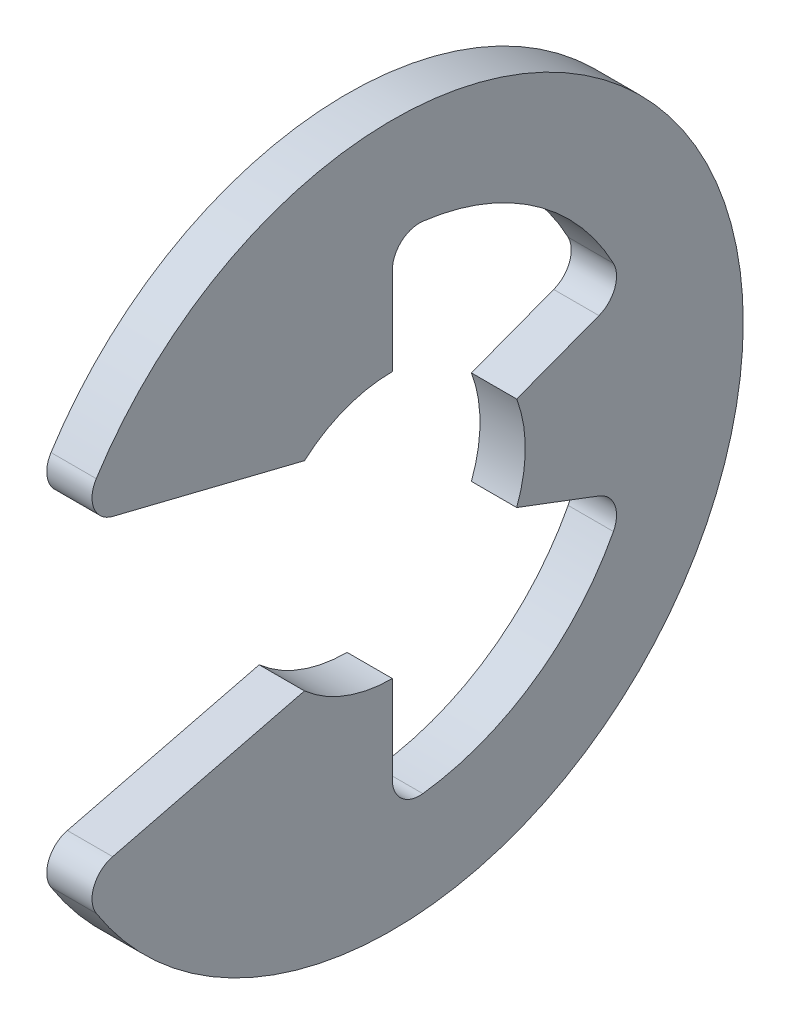
ISO-10303-21;
HEADER;
FILE_DESCRIPTION(('STEP AP214'),'2;1');
FILE_NAME('part.step','',(''),(''),'','','');
FILE_SCHEMA(('AUTOMOTIVE_DESIGN { 1 0 10303 214 1 1 1 1 }'));
ENDSEC;
DATA;
#1=APPLICATION_CONTEXT('core data for automotive mechanical design processes');
#2=APPLICATION_PROTOCOL_DEFINITION('international standard','automotive_design',2000,#1);
#3=PRODUCT_CONTEXT('',#1,'mechanical');
#4=PRODUCT('Part','Part','',(#3));
#5=PRODUCT_RELATED_PRODUCT_CATEGORY('part','',(#4));
#6=PRODUCT_DEFINITION_FORMATION('','',#4);
#7=PRODUCT_DEFINITION_CONTEXT('part definition',#1,'design');
#8=PRODUCT_DEFINITION('design','',#6,#7);
#9=PRODUCT_DEFINITION_SHAPE('','',#8);
#10=(LENGTH_UNIT() NAMED_UNIT(*) SI_UNIT(.MILLI.,.METRE.));
#11=(NAMED_UNIT(*) PLANE_ANGLE_UNIT() SI_UNIT($,.RADIAN.));
#12=(NAMED_UNIT(*) SI_UNIT($,.STERADIAN.) SOLID_ANGLE_UNIT());
#13=UNCERTAINTY_MEASURE_WITH_UNIT(LENGTH_MEASURE(1.E-05),#10,'distance_accuracy_value','');
#14=(GEOMETRIC_REPRESENTATION_CONTEXT(3) GLOBAL_UNCERTAINTY_ASSIGNED_CONTEXT((#13)) GLOBAL_UNIT_ASSIGNED_CONTEXT((#10,
#11,#12)) REPRESENTATION_CONTEXT('',''));
#15=CARTESIAN_POINT('',(0.,0.,0.));
#16=DIRECTION('',(0.,0.,1.));
#17=DIRECTION('',(1.,0.,0.));
#18=AXIS2_PLACEMENT_3D('',#15,#16,#17);
#19=CARTESIAN_POINT('',(0.350000000000183,0.,0.));
#20=DIRECTION('',(-1.,0.,0.));
#21=DIRECTION('',(0.,0.,1.));
#22=AXIS2_PLACEMENT_3D('',#19,#20,#21);
#23=CYLINDRICAL_SURFACE('',#22,5.425);
#24=CARTESIAN_POINT('',(0.350000000000183,0.,0.));
#25=DIRECTION('',(1.,0.,0.));
#26=DIRECTION('',(0.,0.,-1.));
#27=AXIS2_PLACEMENT_3D('',#24,#25,#26);
#28=CIRCLE('',#27,5.425);
#29=CARTESIAN_POINT('',(0.350000000000295,-2.91048609757349,4.57817602062516));
#30=VERTEX_POINT('',#29);
#31=CARTESIAN_POINT('',(0.35000000000085,2.91048609757416,4.57817602062541));
#32=VERTEX_POINT('',#31);
#33=EDGE_CURVE('E179',#30,#32,#28,.T.);
#34=ORIENTED_EDGE('',*,*,#33,.F.);
#35=DIRECTION('',(-1.,0.,0.));
#36=VECTOR('',#35,1.);
#37=CARTESIAN_POINT('',(0.350000000000295,-2.91048609757349,4.57817602062516));
#38=LINE('',#37,#36);
#39=CARTESIAN_POINT('',(-0.349999999999684,-2.91048609757349,4.57817602062538));
#40=VERTEX_POINT('',#39);
#41=EDGE_CURVE('E273',#30,#40,#38,.T.);
#42=ORIENTED_EDGE('',*,*,#41,.T.);
#43=CARTESIAN_POINT('',(-0.349999999999961,-1.66533453693773E-13,0.));
#44=DIRECTION('',(1.,0.,0.));
#45=DIRECTION('',(0.,0.,-1.));
#46=AXIS2_PLACEMENT_3D('',#43,#44,#45);
#47=CIRCLE('',#46,5.425);
#48=CARTESIAN_POINT('',(-0.349999999999184,2.91048609757394,4.57817602062541));
#49=VERTEX_POINT('',#48);
#50=EDGE_CURVE('E217',#40,#49,#47,.T.);
#51=ORIENTED_EDGE('',*,*,#50,.T.);
#52=DIRECTION('',(-1.,0.,0.));
#53=VECTOR('',#52,1.);
#54=CARTESIAN_POINT('',(0.35000000000085,2.91048609757416,4.57817602062541));
#55=LINE('',#54,#53);
#56=EDGE_CURVE('E271',#49,#32,#55,.F.);
#57=ORIENTED_EDGE('',*,*,#56,.T.);
#58=EDGE_LOOP('',(#34,#42,#51,#57));
#59=FACE_BOUND('',#58,.T.);
#60=ADVANCED_FACE('F41',(#59),#23,.T.);
#61=CARTESIAN_POINT('',(0.350000000000683,2.41039731260284,4.86010388730507));
#62=DIRECTION('',(0.,0.97053682992537,-0.240952820606874));
#63=DIRECTION('',(0.,0.240952820606873,0.970536829925373));
#64=AXIS2_PLACEMENT_3D('',#61,#62,#63);
#65=PLANE('',#64);
#66=DIRECTION('',(0.,-0.240952820606873,-0.970536829925373));
#67=VECTOR('',#66,1.);
#68=CARTESIAN_POINT('',(0.350000000000683,2.41039731260284,4.86010388730507));
#69=LINE('',#68,#67);
#70=CARTESIAN_POINT('',(0.350000000000683,2.27753267306377,4.32493677142581));
#71=VERTEX_POINT('',#70);
#72=CARTESIAN_POINT('',(0.350000000000183,1.54124999999961,1.35925473606036));
#73=VERTEX_POINT('',#72);
#74=EDGE_CURVE('E165',#71,#73,#69,.T.);
#75=ORIENTED_EDGE('',*,*,#74,.F.);
#76=DIRECTION('',(-1.,0.,0.));
#77=VECTOR('',#76,1.);
#78=CARTESIAN_POINT('',(0.350000000000683,2.27753267306377,4.32493677142581));
#79=LINE('',#78,#77);
#80=CARTESIAN_POINT('',(-0.349999999999129,2.27753267306396,4.32493677142642));
#81=VERTEX_POINT('',#80);
#82=EDGE_CURVE('E285',#71,#81,#79,.T.);
#83=ORIENTED_EDGE('',*,*,#82,.T.);
#84=DIRECTION('',(0.,-0.240952820606873,-0.970536829925373));
#85=VECTOR('',#84,1.);
#86=CARTESIAN_POINT('',(-0.349999999999406,2.41039731260312,4.86010388730551));
#87=LINE('',#86,#85);
#88=CARTESIAN_POINT('',(-0.349999999999906,1.54125000000011,1.35925473606016));
#89=VERTEX_POINT('',#88);
#90=EDGE_CURVE('E185',#81,#89,#87,.T.);
#91=ORIENTED_EDGE('',*,*,#90,.T.);
#92=DIRECTION('',(-1.,0.,0.));
#93=VECTOR('',#92,1.);
#94=CARTESIAN_POINT('',(0.350000000000183,1.54124999999961,1.35925473606036));
#95=LINE('',#94,#93);
#96=EDGE_CURVE('E182',#73,#89,#95,.T.);
#97=ORIENTED_EDGE('',*,*,#96,.F.);
#98=EDGE_LOOP('',(#75,#83,#91,#97));
#99=FACE_BOUND('',#98,.T.);
#100=ADVANCED_FACE('F183',(#99),#65,.F.);
#101=CARTESIAN_POINT('',(0.350000000000183,0.,0.));
#102=DIRECTION('',(-1.,0.,0.));
#103=DIRECTION('',(0.,0.,1.));
#104=AXIS2_PLACEMENT_3D('',#101,#102,#103);
#105=CYLINDRICAL_SURFACE('',#104,2.055);
#106=CARTESIAN_POINT('',(-0.349999999999961,-1.66533453693773E-13,0.));
#107=DIRECTION('',(-1.,0.,0.));
#108=DIRECTION('',(0.,0.,1.));
#109=AXIS2_PLACEMENT_3D('',#106,#107,#108);
#110=CIRCLE('',#109,2.055);
#111=CARTESIAN_POINT('',(-0.350000000000128,2.05499999999928,4.71844785465692E-13));
#112=VERTEX_POINT('',#111);
#113=EDGE_CURVE('E221',#89,#112,#110,.T.);
#114=ORIENTED_EDGE('',*,*,#113,.T.);
#115=DIRECTION('',(-1.,0.,0.));
#116=VECTOR('',#115,1.);
#117=CARTESIAN_POINT('',(0.350000000000128,2.05499999999947,9.43689570931383E-13));
#118=LINE('',#117,#116);
#119=CARTESIAN_POINT('',(0.350000000000128,2.05499999999947,9.43689570931383E-13));
#120=VERTEX_POINT('',#119);
#121=EDGE_CURVE('E189',#120,#112,#118,.T.);
#122=ORIENTED_EDGE('',*,*,#121,.F.);
#123=CARTESIAN_POINT('',(0.350000000000183,0.,0.));
#124=DIRECTION('',(-1.,0.,0.));
#125=DIRECTION('',(0.,0.,1.));
#126=AXIS2_PLACEMENT_3D('',#123,#124,#125);
#127=CIRCLE('',#126,2.055);
#128=EDGE_CURVE('E171',#73,#120,#127,.T.);
#129=ORIENTED_EDGE('',*,*,#128,.F.);
#130=ORIENTED_EDGE('',*,*,#96,.T.);
#131=EDGE_LOOP('',(#114,#122,#129,#130));
#132=FACE_BOUND('',#131,.T.);
#133=ADVANCED_FACE('F191',(#132),#105,.F.);
#134=CARTESIAN_POINT('',(0.350000000000128,2.05499999999947,9.43689570931383E-13));
#135=DIRECTION('',(0.,0.,1.));
#136=DIRECTION('',(0.,-0.999999999999997,0.));
#137=AXIS2_PLACEMENT_3D('',#134,#135,#136);
#138=PLANE('',#137);
#139=DIRECTION('',(0.,0.999999999999997,0.));
#140=VECTOR('',#139,1.);
#141=CARTESIAN_POINT('',(-0.350000000000128,2.05499999999928,4.71844785465692E-13));
#142=LINE('',#141,#140);
#143=CARTESIAN_POINT('',(-0.34999999999985,3.41491421940709,0.));
#144=VERTEX_POINT('',#143);
#145=EDGE_CURVE('E223',#112,#144,#142,.T.);
#146=ORIENTED_EDGE('',*,*,#145,.T.);
#147=DIRECTION('',(1.,0.,0.));
#148=VECTOR('',#147,1.);
#149=CARTESIAN_POINT('',(0.350000000000239,3.41491421940709,-4.44089209850063E-13));
#150=LINE('',#149,#148);
#151=CARTESIAN_POINT('',(0.350000000000239,3.41491421940709,-4.44089209850063E-13));
#152=VERTEX_POINT('',#151);
#153=EDGE_CURVE('E269',#144,#152,#150,.T.);
#154=ORIENTED_EDGE('',*,*,#153,.T.);
#155=DIRECTION('',(0.,0.999999999999997,0.));
#156=VECTOR('',#155,1.);
#157=CARTESIAN_POINT('',(0.350000000000128,2.05499999999947,9.43689570931383E-13));
#158=LINE('',#157,#156);
#159=EDGE_CURVE('E194',#120,#152,#158,.T.);
#160=ORIENTED_EDGE('',*,*,#159,.F.);
#161=ORIENTED_EDGE('',*,*,#121,.T.);
#162=EDGE_LOOP('',(#146,#154,#160,#161));
#163=FACE_BOUND('',#162,.T.);
#164=ADVANCED_FACE('F391',(#163),#138,.F.);
#165=CARTESIAN_POINT('',(0.350000000000183,0.,0.));
#166=DIRECTION('',(-1.,0.,0.));
#167=DIRECTION('',(0.,0.,1.));
#168=AXIS2_PLACEMENT_3D('',#165,#166,#167);
#169=CYLINDRICAL_SURFACE('',#168,3.86064516129032);
#170=CARTESIAN_POINT('',(0.350000000000183,0.,0.));
#171=DIRECTION('',(-1.,0.,0.));
#172=DIRECTION('',(0.,0.,-1.));
#173=AXIS2_PLACEMENT_3D('',#170,#171,#172);
#174=CIRCLE('',#173,3.86064516129032);
#175=CARTESIAN_POINT('',(0.350000000000183,3.831773240002,-0.471269454340478));
#176=VERTEX_POINT('',#175);
#177=CARTESIAN_POINT('',(0.350000000000295,1.79556862973601,-3.41767674850946));
#178=VERTEX_POINT('',#177);
#179=EDGE_CURVE('E196',#176,#178,#174,.T.);
#180=ORIENTED_EDGE('',*,*,#179,.F.);
#181=DIRECTION('',(-1.,0.,0.));
#182=VECTOR('',#181,1.);
#183=CARTESIAN_POINT('',(0.350000000000183,3.831773240002,-0.471269454340478));
#184=LINE('',#183,#182);
#185=CARTESIAN_POINT('',(-0.349999999999795,3.83177324000242,-0.471269454340506));
#186=VERTEX_POINT('',#185);
#187=EDGE_CURVE('E266',#176,#186,#184,.T.);
#188=ORIENTED_EDGE('',*,*,#187,.T.);
#189=CARTESIAN_POINT('',(-0.349999999999961,-1.66533453693773E-13,0.));
#190=DIRECTION('',(-1.,0.,0.));
#191=DIRECTION('',(0.,0.,-1.));
#192=AXIS2_PLACEMENT_3D('',#189,#190,#191);
#193=CIRCLE('',#192,3.86064516129032);
#194=CARTESIAN_POINT('',(-0.349999999999739,1.79556862973621,-3.41767674850876));
#195=VERTEX_POINT('',#194);
#196=EDGE_CURVE('E226',#186,#195,#193,.T.);
#197=ORIENTED_EDGE('',*,*,#196,.T.);
#198=DIRECTION('',(-1.,0.,0.));
#199=VECTOR('',#198,1.);
#200=CARTESIAN_POINT('',(0.350000000000295,1.79556862973601,-3.41767674850946));
#201=LINE('',#200,#199);
#202=EDGE_CURVE('E264',#195,#178,#201,.F.);
#203=ORIENTED_EDGE('',*,*,#202,.T.);
#204=EDGE_LOOP('',(#180,#188,#197,#203));
#205=FACE_BOUND('',#204,.T.);
#206=ADVANCED_FACE('F313',(#205),#169,.F.);
#207=CARTESIAN_POINT('',(0.349999999999961,0.726552217669374,-1.92227648245508));
#208=DIRECTION('',(0.,-0.935414346693482,-0.353553390593276));
#209=DIRECTION('',(0.,0.353553390593274,-0.935414346693486));
#210=AXIS2_PLACEMENT_3D('',#207,#208,#209);
#211=PLANE('',#210);
#212=DIRECTION('',(0.,-0.353553390593274,0.935414346693486));
#213=VECTOR('',#212,1.);
#214=CARTESIAN_POINT('',(0.349999999999961,0.726552217669374,-1.92227648245508));
#215=LINE('',#214,#213);
#216=CARTESIAN_POINT('',(0.350000000000739,1.20735450085685,-3.19435975356042));
#217=VERTEX_POINT('',#216);
#218=CARTESIAN_POINT('',(0.349999999999961,0.726552217669374,-1.92227648245508));
#219=VERTEX_POINT('',#218);
#220=EDGE_CURVE('E201',#217,#219,#215,.T.);
#221=ORIENTED_EDGE('',*,*,#220,.F.);
#222=DIRECTION('',(1.,0.,0.));
#223=VECTOR('',#222,1.);
#224=CARTESIAN_POINT('',(-0.349999999999406,1.20735450085668,-3.19435975356036));
#225=LINE('',#224,#223);
#226=CARTESIAN_POINT('',(-0.349999999999406,1.20735450085668,-3.19435975356036));
#227=VERTEX_POINT('',#226);
#228=EDGE_CURVE('E288',#217,#227,#225,.F.);
#229=ORIENTED_EDGE('',*,*,#228,.T.);
#230=DIRECTION('',(0.,-0.353553390593274,0.935414346693486));
#231=VECTOR('',#230,1.);
#232=CARTESIAN_POINT('',(-0.350000000000072,0.726552217669402,-1.92227648245488));
#233=LINE('',#232,#231);
#234=CARTESIAN_POINT('',(-0.350000000000072,0.726552217669402,-1.92227648245488));
#235=VERTEX_POINT('',#234);
#236=EDGE_CURVE('E229',#227,#235,#233,.T.);
#237=ORIENTED_EDGE('',*,*,#236,.T.);
#238=DIRECTION('',(-1.,0.,0.));
#239=VECTOR('',#238,1.);
#240=CARTESIAN_POINT('',(0.349999999999961,0.726552217669374,-1.92227648245508));
#241=LINE('',#240,#239);
#242=EDGE_CURVE('E253',#219,#235,#241,.T.);
#243=ORIENTED_EDGE('',*,*,#242,.F.);
#244=EDGE_LOOP('',(#221,#229,#237,#243));
#245=FACE_BOUND('',#244,.T.);
#246=ADVANCED_FACE('F316',(#245),#211,.F.);
#247=CARTESIAN_POINT('',(0.350000000000183,0.,0.));
#248=DIRECTION('',(-1.,0.,0.));
#249=DIRECTION('',(0.,0.,1.));
#250=AXIS2_PLACEMENT_3D('',#247,#248,#249);
#251=CYLINDRICAL_SURFACE('',#250,2.055);
#252=CARTESIAN_POINT('',(-0.349999999999961,-1.66533453693773E-13,0.));
#253=DIRECTION('',(-1.,0.,0.));
#254=DIRECTION('',(0.,0.,1.));
#255=AXIS2_PLACEMENT_3D('',#252,#253,#254);
#256=CIRCLE('',#255,2.055);
#257=CARTESIAN_POINT('',(-0.35000000000035,-0.726552217668708,-1.92227648245488));
#258=VERTEX_POINT('',#257);
#259=EDGE_CURVE('E231',#235,#258,#256,.T.);
#260=ORIENTED_EDGE('',*,*,#259,.T.);
#261=DIRECTION('',(-1.,0.,0.));
#262=VECTOR('',#261,1.);
#263=CARTESIAN_POINT('',(0.349999999999628,-0.726552217668652,-1.92227648245491));
#264=LINE('',#263,#262);
#265=CARTESIAN_POINT('',(0.349999999999628,-0.726552217668652,-1.92227648245491));
#266=VERTEX_POINT('',#265);
#267=EDGE_CURVE('E250',#266,#258,#264,.T.);
#268=ORIENTED_EDGE('',*,*,#267,.F.);
#269=CARTESIAN_POINT('',(0.350000000000183,0.,0.));
#270=DIRECTION('',(-1.,0.,0.));
#271=DIRECTION('',(0.,0.,1.));
#272=AXIS2_PLACEMENT_3D('',#269,#270,#271);
#273=CIRCLE('',#272,2.055);
#274=EDGE_CURVE('E203',#219,#266,#273,.T.);
#275=ORIENTED_EDGE('',*,*,#274,.F.);
#276=ORIENTED_EDGE('',*,*,#242,.T.);
#277=EDGE_LOOP('',(#260,#268,#275,#276));
#278=FACE_BOUND('',#277,.T.);
#279=ADVANCED_FACE('F322',(#278),#251,.F.);
#280=CARTESIAN_POINT('',(0.349999999999628,-0.726552217668652,-1.92227648245491));
#281=DIRECTION('',(0.,0.935414346693482,-0.353553390593273));
#282=DIRECTION('',(0.,0.353553390593275,0.935414346693486));
#283=AXIS2_PLACEMENT_3D('',#280,#281,#282);
#284=PLANE('',#283);
#285=DIRECTION('',(0.,-0.353553390593275,-0.935414346693486));
#286=VECTOR('',#285,1.);
#287=CARTESIAN_POINT('',(-0.35000000000035,-0.726552217668708,-1.92227648245488));
#288=LINE('',#287,#286);
#289=CARTESIAN_POINT('',(-0.350000000000017,-1.20735450085663,-3.19435975356153));
#290=VERTEX_POINT('',#289);
#291=EDGE_CURVE('E233',#258,#290,#288,.T.);
#292=ORIENTED_EDGE('',*,*,#291,.T.);
#293=DIRECTION('',(1.,0.,0.));
#294=VECTOR('',#293,1.);
#295=CARTESIAN_POINT('',(0.350000000000017,-1.20735450085641,-3.19435975356086));
#296=LINE('',#295,#294);
#297=CARTESIAN_POINT('',(0.350000000000017,-1.20735450085641,-3.19435975356086));
#298=VERTEX_POINT('',#297);
#299=EDGE_CURVE('E56',#290,#298,#296,.T.);
#300=ORIENTED_EDGE('',*,*,#299,.T.);
#301=DIRECTION('',(0.,-0.353553390593275,-0.935414346693486));
#302=VECTOR('',#301,1.);
#303=CARTESIAN_POINT('',(0.349999999999628,-0.726552217668652,-1.92227648245491));
#304=LINE('',#303,#302);
#305=EDGE_CURVE('E205',#266,#298,#304,.T.);
#306=ORIENTED_EDGE('',*,*,#305,.F.);
#307=ORIENTED_EDGE('',*,*,#267,.T.);
#308=EDGE_LOOP('',(#292,#300,#306,#307));
#309=FACE_BOUND('',#308,.T.);
#310=ADVANCED_FACE('F324',(#309),#284,.F.);
#311=CARTESIAN_POINT('',(0.350000000000183,0.,0.));
#312=DIRECTION('',(-1.,0.,0.));
#313=DIRECTION('',(0.,0.,1.));
#314=AXIS2_PLACEMENT_3D('',#311,#312,#313);
#315=CYLINDRICAL_SURFACE('',#314,3.86064516129032);
#316=CARTESIAN_POINT('',(-0.349999999999961,-1.66533453693773E-13,0.));
#317=DIRECTION('',(-1.,0.,0.));
#318=DIRECTION('',(0.,0.,-1.));
#319=AXIS2_PLACEMENT_3D('',#316,#317,#318);
#320=CIRCLE('',#319,3.86064516129032);
#321=CARTESIAN_POINT('',(-0.350000000000295,-1.79556862973662,-3.41767674850907));
#322=VERTEX_POINT('',#321);
#323=CARTESIAN_POINT('',(-0.349999999999073,-3.83177324000283,-0.471269454340256));
#324=VERTEX_POINT('',#323);
#325=EDGE_CURVE('E235',#322,#324,#320,.T.);
#326=ORIENTED_EDGE('',*,*,#325,.T.);
#327=DIRECTION('',(-1.,0.,0.));
#328=VECTOR('',#327,1.);
#329=CARTESIAN_POINT('',(0.35000000000085,-3.83177324000278,-0.471269454340284));
#330=LINE('',#329,#328);
#331=CARTESIAN_POINT('',(0.35000000000085,-3.83177324000278,-0.471269454340284));
#332=VERTEX_POINT('',#331);
#333=EDGE_CURVE('E262',#324,#332,#330,.F.);
#334=ORIENTED_EDGE('',*,*,#333,.T.);
#335=CARTESIAN_POINT('',(0.350000000000183,0.,0.));
#336=DIRECTION('',(-1.,0.,0.));
#337=DIRECTION('',(0.,0.,-1.));
#338=AXIS2_PLACEMENT_3D('',#335,#336,#337);
#339=CIRCLE('',#338,3.86064516129032);
#340=CARTESIAN_POINT('',(0.349999999999795,-1.79556862973612,-3.41767674850948));
#341=VERTEX_POINT('',#340);
#342=EDGE_CURVE('E207',#341,#332,#339,.T.);
#343=ORIENTED_EDGE('',*,*,#342,.F.);
#344=DIRECTION('',(-1.,0.,0.));
#345=VECTOR('',#344,1.);
#346=CARTESIAN_POINT('',(0.349999999999795,-1.79556862973612,-3.41767674850948));
#347=LINE('',#346,#345);
#348=EDGE_CURVE('E259',#341,#322,#347,.T.);
#349=ORIENTED_EDGE('',*,*,#348,.T.);
#350=EDGE_LOOP('',(#326,#334,#343,#349));
#351=FACE_BOUND('',#350,.T.);
#352=ADVANCED_FACE('F326',(#351),#315,.F.);
#353=CARTESIAN_POINT('',(0.350000000000628,-2.05500000000056,-1.94289029309402E-13));
#354=DIRECTION('',(0.,0.,1.));
#355=DIRECTION('',(0.,-0.999999999999997,0.));
#356=AXIS2_PLACEMENT_3D('',#353,#354,#355);
#357=PLANE('',#356);
#358=DIRECTION('',(0.,0.999999999999997,0.));
#359=VECTOR('',#358,1.);
#360=CARTESIAN_POINT('',(0.350000000000628,-2.05500000000056,-1.94289029309402E-13));
#361=LINE('',#360,#359);
#362=CARTESIAN_POINT('',(0.350000000000072,-3.41491421940732,4.44089209850063E-13));
#363=VERTEX_POINT('',#362);
#364=CARTESIAN_POINT('',(0.350000000000628,-2.05500000000056,-1.94289029309402E-13));
#365=VERTEX_POINT('',#364);
#366=EDGE_CURVE('E210',#363,#365,#361,.T.);
#367=ORIENTED_EDGE('',*,*,#366,.F.);
#368=DIRECTION('',(1.,0.,0.));
#369=VECTOR('',#368,1.);
#370=CARTESIAN_POINT('',(-0.349999999999961,-3.41491421940726,8.88178419700125E-13));
#371=LINE('',#370,#369);
#372=CARTESIAN_POINT('',(-0.349999999999961,-3.41491421940726,8.88178419700125E-13));
#373=VERTEX_POINT('',#372);
#374=EDGE_CURVE('E188',#363,#373,#371,.F.);
#375=ORIENTED_EDGE('',*,*,#374,.T.);
#376=DIRECTION('',(0.,0.999999999999997,0.));
#377=VECTOR('',#376,1.);
#378=CARTESIAN_POINT('',(-0.349999999999684,-2.05500000000031,0.));
#379=LINE('',#378,#377);
#380=CARTESIAN_POINT('',(-0.349999999999684,-2.05500000000031,0.));
#381=VERTEX_POINT('',#380);
#382=EDGE_CURVE('E238',#373,#381,#379,.T.);
#383=ORIENTED_EDGE('',*,*,#382,.T.);
#384=DIRECTION('',(-1.,0.,0.));
#385=VECTOR('',#384,1.);
#386=CARTESIAN_POINT('',(0.350000000000628,-2.05500000000056,-1.94289029309402E-13));
#387=LINE('',#386,#385);
#388=EDGE_CURVE('E247',#365,#381,#387,.T.);
#389=ORIENTED_EDGE('',*,*,#388,.F.);
#390=EDGE_LOOP('',(#367,#375,#383,#389));
#391=FACE_BOUND('',#390,.T.);
#392=ADVANCED_FACE('F332',(#391),#357,.F.);
#393=CARTESIAN_POINT('',(0.350000000000183,0.,0.));
#394=DIRECTION('',(-1.,0.,0.));
#395=DIRECTION('',(0.,0.,1.));
#396=AXIS2_PLACEMENT_3D('',#393,#394,#395);
#397=CYLINDRICAL_SURFACE('',#396,2.055);
#398=CARTESIAN_POINT('',(-0.349999999999961,-1.66533453693773E-13,0.));
#399=DIRECTION('',(-1.,0.,0.));
#400=DIRECTION('',(0.,0.,-1.));
#401=AXIS2_PLACEMENT_3D('',#398,#399,#400);
#402=CIRCLE('',#401,2.055);
#403=CARTESIAN_POINT('',(-0.349999999999517,-1.54125000000022,1.35925473605947));
#404=VERTEX_POINT('',#403);
#405=EDGE_CURVE('E240',#381,#404,#402,.T.);
#406=ORIENTED_EDGE('',*,*,#405,.T.);
#407=DIRECTION('',(-1.,0.,0.));
#408=VECTOR('',#407,1.);
#409=CARTESIAN_POINT('',(0.350000000000628,-1.54125000000027,1.35925473605977));
#410=LINE('',#409,#408);
#411=CARTESIAN_POINT('',(0.350000000000628,-1.54125000000027,1.35925473605977));
#412=VERTEX_POINT('',#411);
#413=EDGE_CURVE('E216',#412,#404,#410,.T.);
#414=ORIENTED_EDGE('',*,*,#413,.F.);
#415=CARTESIAN_POINT('',(0.350000000000183,0.,0.));
#416=DIRECTION('',(-1.,0.,0.));
#417=DIRECTION('',(0.,0.,-1.));
#418=AXIS2_PLACEMENT_3D('',#415,#416,#417);
#419=CIRCLE('',#418,2.055);
#420=EDGE_CURVE('E212',#365,#412,#419,.T.);
#421=ORIENTED_EDGE('',*,*,#420,.F.);
#422=ORIENTED_EDGE('',*,*,#388,.T.);
#423=EDGE_LOOP('',(#406,#414,#421,#422));
#424=FACE_BOUND('',#423,.T.);
#425=ADVANCED_FACE('F381',(#424),#397,.F.);
#426=CARTESIAN_POINT('',(0.350000000000628,-2.41039731260284,4.86010388730507));
#427=DIRECTION('',(0.,-0.97053682992537,-0.240952820606874));
#428=DIRECTION('',(0.,0.240952820606873,-0.970536829925373));
#429=AXIS2_PLACEMENT_3D('',#426,#427,#428);
#430=PLANE('',#429);
#431=DIRECTION('',(0.,-0.240952820606873,0.970536829925373));
#432=VECTOR('',#431,1.);
#433=CARTESIAN_POINT('',(-0.34999999999924,-2.41039731260259,4.86010388730509));
#434=LINE('',#433,#432);
#435=CARTESIAN_POINT('',(-0.349999999999684,-2.27753267306324,4.32493677142581));
#436=VERTEX_POINT('',#435);
#437=EDGE_CURVE('E242',#404,#436,#434,.T.);
#438=ORIENTED_EDGE('',*,*,#437,.T.);
#439=DIRECTION('',(-1.,0.,0.));
#440=VECTOR('',#439,1.);
#441=CARTESIAN_POINT('',(0.35000000000035,-2.2775326730633,4.32493677142554));
#442=LINE('',#441,#440);
#443=CARTESIAN_POINT('',(0.35000000000035,-2.2775326730633,4.32493677142554));
#444=VERTEX_POINT('',#443);
#445=EDGE_CURVE('E280',#436,#444,#442,.F.);
#446=ORIENTED_EDGE('',*,*,#445,.T.);
#447=DIRECTION('',(0.,-0.240952820606873,0.970536829925373));
#448=VECTOR('',#447,1.);
#449=CARTESIAN_POINT('',(0.350000000000628,-2.41039731260284,4.86010388730507));
#450=LINE('',#449,#448);
#451=EDGE_CURVE('E214',#412,#444,#450,.T.);
#452=ORIENTED_EDGE('',*,*,#451,.F.);
#453=ORIENTED_EDGE('',*,*,#413,.T.);
#454=EDGE_LOOP('',(#438,#446,#452,#453));
#455=FACE_BOUND('',#454,.T.);
#456=ADVANCED_FACE('F413',(#455),#430,.F.);
#457=CARTESIAN_POINT('',(0.350000000000183,0.,0.));
#458=DIRECTION('',(1.,0.,0.));
#459=DIRECTION('',(0.,0.,-1.));
#460=AXIS2_PLACEMENT_3D('',#457,#458,#459);
#461=PLANE('',#460);
#462=ORIENTED_EDGE('',*,*,#451,.T.);
#463=CARTESIAN_POINT('',(0.350000000000739,-2.68515814163273,4.22373658677011));
#464=DIRECTION('',(1.,0.,0.));
#465=DIRECTION('',(0.,0.,-1.));
#466=AXIS2_PLACEMENT_3D('',#463,#464,#465);
#467=CIRCLE('',#466,0.42);
#468=EDGE_CURVE('E283',#444,#30,#467,.T.);
#469=ORIENTED_EDGE('',*,*,#468,.T.);
#470=ORIENTED_EDGE('',*,*,#33,.T.);
#471=CARTESIAN_POINT('',(0.350000000000572,2.68515814163275,4.223736586771));
#472=DIRECTION('',(1.,0.,0.));
#473=DIRECTION('',(0.,0.,-1.));
#474=AXIS2_PLACEMENT_3D('',#471,#472,#473);
#475=CIRCLE('',#474,0.42);
#476=EDGE_CURVE('E175',#32,#71,#475,.T.);
#477=ORIENTED_EDGE('',*,*,#476,.T.);
#478=ORIENTED_EDGE('',*,*,#74,.T.);
#479=ORIENTED_EDGE('',*,*,#128,.T.);
#480=ORIENTED_EDGE('',*,*,#159,.T.);
#481=CARTESIAN_POINT('',(0.350000000000628,3.41491421940715,-0.420000000000142));
#482=DIRECTION('',(1.,0.,0.));
#483=DIRECTION('',(0.,0.,-1.));
#484=AXIS2_PLACEMENT_3D('',#481,#482,#483);
#485=CIRCLE('',#484,0.42);
#486=EDGE_CURVE('E297',#152,#176,#485,.F.);
#487=ORIENTED_EDGE('',*,*,#486,.T.);
#488=ORIENTED_EDGE('',*,*,#179,.T.);
#489=CARTESIAN_POINT('',(0.349999999999961,1.60022852646846,-3.04586732951129));
#490=DIRECTION('',(1.,0.,0.));
#491=DIRECTION('',(0.,0.,-1.));
#492=AXIS2_PLACEMENT_3D('',#489,#490,#491);
#493=CIRCLE('',#492,0.42);
#494=EDGE_CURVE('E11',#178,#217,#493,.F.);
#495=ORIENTED_EDGE('',*,*,#494,.T.);
#496=ORIENTED_EDGE('',*,*,#220,.T.);
#497=ORIENTED_EDGE('',*,*,#274,.T.);
#498=ORIENTED_EDGE('',*,*,#305,.T.);
#499=CARTESIAN_POINT('',(0.34999999999985,-1.60022852646757,-3.0458673295124));
#500=DIRECTION('',(1.,0.,0.));
#501=DIRECTION('',(0.,0.,-1.));
#502=AXIS2_PLACEMENT_3D('',#499,#500,#501);
#503=CIRCLE('',#502,0.42);
#504=EDGE_CURVE('E301',#298,#341,#503,.F.);
#505=ORIENTED_EDGE('',*,*,#504,.T.);
#506=ORIENTED_EDGE('',*,*,#342,.T.);
#507=CARTESIAN_POINT('',(0.34999999999985,-3.41491421940771,-0.419999999999615));
#508=DIRECTION('',(1.,0.,0.));
#509=DIRECTION('',(0.,0.,-1.));
#510=AXIS2_PLACEMENT_3D('',#507,#508,#509);
#511=CIRCLE('',#510,0.42);
#512=EDGE_CURVE('E293',#332,#363,#511,.F.);
#513=ORIENTED_EDGE('',*,*,#512,.T.);
#514=ORIENTED_EDGE('',*,*,#366,.T.);
#515=ORIENTED_EDGE('',*,*,#420,.T.);
#516=EDGE_LOOP('',(#462,#469,#470,#477,#478,#479,#480,#487,#488,#495,#496,#497,#498,#505,#506,
#513,#514,#515));
#517=FACE_BOUND('',#516,.T.);
#518=ADVANCED_FACE('F168',(#517),#461,.T.);
#519=CARTESIAN_POINT('',(-0.349999999999961,-1.66533453693773E-13,0.));
#520=DIRECTION('',(1.,0.,0.));
#521=DIRECTION('',(0.,0.,-1.));
#522=AXIS2_PLACEMENT_3D('',#519,#520,#521);
#523=PLANE('',#522);
#524=ORIENTED_EDGE('',*,*,#50,.F.);
#525=CARTESIAN_POINT('',(-0.349999999999462,-2.68515814163273,4.22373658676992));
#526=DIRECTION('',(1.,0.,0.));
#527=DIRECTION('',(0.,0.,-1.));
#528=AXIS2_PLACEMENT_3D('',#525,#526,#527);
#529=CIRCLE('',#528,0.42);
#530=EDGE_CURVE('E278',#40,#436,#529,.F.);
#531=ORIENTED_EDGE('',*,*,#530,.T.);
#532=ORIENTED_EDGE('',*,*,#437,.F.);
#533=ORIENTED_EDGE('',*,*,#405,.F.);
#534=ORIENTED_EDGE('',*,*,#382,.F.);
#535=CARTESIAN_POINT('',(-0.350000000000183,-3.41491421940732,-0.419999999999615));
#536=DIRECTION('',(1.,0.,0.));
#537=DIRECTION('',(0.,0.,-1.));
#538=AXIS2_PLACEMENT_3D('',#535,#536,#537);
#539=CIRCLE('',#538,0.42);
#540=EDGE_CURVE('E291',#373,#324,#539,.T.);
#541=ORIENTED_EDGE('',*,*,#540,.T.);
#542=ORIENTED_EDGE('',*,*,#325,.F.);
#543=CARTESIAN_POINT('',(-0.350000000000239,-1.60022852646796,-3.04586732951173));
#544=DIRECTION('',(1.,0.,0.));
#545=DIRECTION('',(0.,0.,-1.));
#546=AXIS2_PLACEMENT_3D('',#543,#544,#545);
#547=CIRCLE('',#546,0.42);
#548=EDGE_CURVE('E299',#322,#290,#547,.T.);
#549=ORIENTED_EDGE('',*,*,#548,.T.);
#550=ORIENTED_EDGE('',*,*,#291,.F.);
#551=ORIENTED_EDGE('',*,*,#259,.F.);
#552=ORIENTED_EDGE('',*,*,#236,.F.);
#553=CARTESIAN_POINT('',(-0.349999999999961,1.60022852646785,-3.04586732951126));
#554=DIRECTION('',(1.,0.,0.));
#555=DIRECTION('',(0.,0.,-1.));
#556=AXIS2_PLACEMENT_3D('',#553,#554,#555);
#557=CIRCLE('',#556,0.42);
#558=EDGE_CURVE('E49',#227,#195,#557,.T.);
#559=ORIENTED_EDGE('',*,*,#558,.T.);
#560=ORIENTED_EDGE('',*,*,#196,.F.);
#561=CARTESIAN_POINT('',(-0.349999999999295,3.41491421940712,-0.420000000000142));
#562=DIRECTION('',(1.,0.,0.));
#563=DIRECTION('',(0.,0.,-1.));
#564=AXIS2_PLACEMENT_3D('',#561,#562,#563);
#565=CIRCLE('',#564,0.42);
#566=EDGE_CURVE('E295',#186,#144,#565,.T.);
#567=ORIENTED_EDGE('',*,*,#566,.T.);
#568=ORIENTED_EDGE('',*,*,#145,.F.);
#569=ORIENTED_EDGE('',*,*,#113,.F.);
#570=ORIENTED_EDGE('',*,*,#90,.F.);
#571=CARTESIAN_POINT('',(-0.349999999999462,2.68515814163273,4.2237365867708));
#572=DIRECTION('',(1.,0.,0.));
#573=DIRECTION('',(0.,0.,-1.));
#574=AXIS2_PLACEMENT_3D('',#571,#572,#573);
#575=CIRCLE('',#574,0.42);
#576=EDGE_CURVE('E276',#81,#49,#575,.F.);
#577=ORIENTED_EDGE('',*,*,#576,.T.);
#578=EDGE_LOOP('',(#524,#531,#532,#533,#534,#541,#542,#549,#550,#551,#552,#559,#560,#567,#568,
#569,#570,#577));
#579=FACE_BOUND('',#578,.T.);
#580=ADVANCED_FACE('F306',(#579),#523,.F.);
#581=CARTESIAN_POINT('',(0.34999999999985,-3.41491421940771,-0.419999999999615));
#582=DIRECTION('',(-1.,0.,0.));
#583=DIRECTION('',(0.,0.,1.));
#584=AXIS2_PLACEMENT_3D('',#581,#582,#583);
#585=CYLINDRICAL_SURFACE('',#584,0.42);
#586=ORIENTED_EDGE('',*,*,#512,.F.);
#587=ORIENTED_EDGE('',*,*,#333,.F.);
#588=ORIENTED_EDGE('',*,*,#540,.F.);
#589=ORIENTED_EDGE('',*,*,#374,.F.);
#590=EDGE_LOOP('',(#586,#587,#588,#589));
#591=FACE_BOUND('',#590,.T.);
#592=ADVANCED_FACE('F346',(#591),#585,.F.);
#593=CARTESIAN_POINT('',(0.350000000000628,3.41491421940715,-0.420000000000142));
#594=DIRECTION('',(-1.,0.,0.));
#595=DIRECTION('',(0.,0.,1.));
#596=AXIS2_PLACEMENT_3D('',#593,#594,#595);
#597=CYLINDRICAL_SURFACE('',#596,0.42);
#598=ORIENTED_EDGE('',*,*,#486,.F.);
#599=ORIENTED_EDGE('',*,*,#153,.F.);
#600=ORIENTED_EDGE('',*,*,#566,.F.);
#601=ORIENTED_EDGE('',*,*,#187,.F.);
#602=EDGE_LOOP('',(#598,#599,#600,#601));
#603=FACE_BOUND('',#602,.T.);
#604=ADVANCED_FACE('F349',(#603),#597,.F.);
#605=CARTESIAN_POINT('',(0.350000000000739,-2.68515814163273,4.22373658677011));
#606=DIRECTION('',(-1.,0.,0.));
#607=DIRECTION('',(0.,0.,1.));
#608=AXIS2_PLACEMENT_3D('',#605,#606,#607);
#609=CYLINDRICAL_SURFACE('',#608,0.42);
#610=ORIENTED_EDGE('',*,*,#468,.F.);
#611=ORIENTED_EDGE('',*,*,#445,.F.);
#612=ORIENTED_EDGE('',*,*,#530,.F.);
#613=ORIENTED_EDGE('',*,*,#41,.F.);
#614=EDGE_LOOP('',(#610,#611,#612,#613));
#615=FACE_BOUND('',#614,.T.);
#616=ADVANCED_FACE('F353',(#615),#609,.T.);
#617=CARTESIAN_POINT('',(0.350000000000572,2.68515814163275,4.223736586771));
#618=DIRECTION('',(-1.,0.,0.));
#619=DIRECTION('',(0.,0.,1.));
#620=AXIS2_PLACEMENT_3D('',#617,#618,#619);
#621=CYLINDRICAL_SURFACE('',#620,0.42);
#622=ORIENTED_EDGE('',*,*,#476,.F.);
#623=ORIENTED_EDGE('',*,*,#56,.F.);
#624=ORIENTED_EDGE('',*,*,#576,.F.);
#625=ORIENTED_EDGE('',*,*,#82,.F.);
#626=EDGE_LOOP('',(#622,#623,#624,#625));
#627=FACE_BOUND('',#626,.T.);
#628=ADVANCED_FACE('F357',(#627),#621,.T.);
#629=CARTESIAN_POINT('',(0.34999999999985,-1.60022852646757,-3.0458673295124));
#630=DIRECTION('',(-1.,0.,0.));
#631=DIRECTION('',(0.,0.,1.));
#632=AXIS2_PLACEMENT_3D('',#629,#630,#631);
#633=CYLINDRICAL_SURFACE('',#632,0.42);
#634=ORIENTED_EDGE('',*,*,#504,.F.);
#635=ORIENTED_EDGE('',*,*,#299,.F.);
#636=ORIENTED_EDGE('',*,*,#548,.F.);
#637=ORIENTED_EDGE('',*,*,#348,.F.);
#638=EDGE_LOOP('',(#634,#635,#636,#637));
#639=FACE_BOUND('',#638,.T.);
#640=ADVANCED_FACE('F360',(#639),#633,.F.);
#641=CARTESIAN_POINT('',(0.349999999999961,1.60022852646846,-3.04586732951129));
#642=DIRECTION('',(-1.,0.,0.));
#643=DIRECTION('',(0.,0.,1.));
#644=AXIS2_PLACEMENT_3D('',#641,#642,#643);
#645=CYLINDRICAL_SURFACE('',#644,0.42);
#646=ORIENTED_EDGE('',*,*,#494,.F.);
#647=ORIENTED_EDGE('',*,*,#202,.F.);
#648=ORIENTED_EDGE('',*,*,#558,.F.);
#649=ORIENTED_EDGE('',*,*,#228,.F.);
#650=EDGE_LOOP('',(#646,#647,#648,#649));
#651=FACE_BOUND('',#650,.T.);
#652=ADVANCED_FACE('F43',(#651),#645,.F.);
#653=CLOSED_SHELL('',(#60,#100,#133,#164,#206,#246,#279,#310,#352,#392,#425,#456,#518,#580,#592,
#604,#616,#628,#640,#652));
#654=MANIFOLD_SOLID_BREP('B2',#653);
#655=ADVANCED_BREP_SHAPE_REPRESENTATION('',(#18,#654),#14);
#656=SHAPE_DEFINITION_REPRESENTATION(#9,#655);
ENDSEC;
END-ISO-10303-21;
